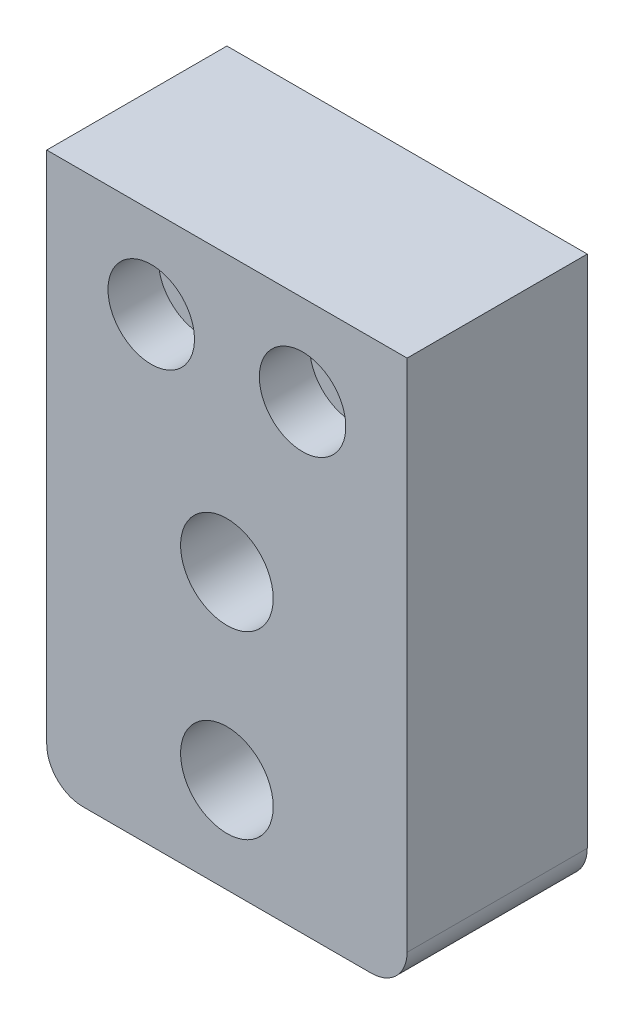
ISO-10303-21;
HEADER;
FILE_DESCRIPTION(('STEP AP214'),'2;1');
FILE_NAME('part.step','',(''),(''),'','','');
FILE_SCHEMA(('AUTOMOTIVE_DESIGN { 1 0 10303 214 1 1 1 1 }'));
ENDSEC;
DATA;
#1=APPLICATION_CONTEXT('core data for automotive mechanical design processes');
#2=APPLICATION_PROTOCOL_DEFINITION('international standard','automotive_design',2000,#1);
#3=PRODUCT_CONTEXT('',#1,'mechanical');
#4=PRODUCT('Part','Part','',(#3));
#5=PRODUCT_RELATED_PRODUCT_CATEGORY('part','',(#4));
#6=PRODUCT_DEFINITION_FORMATION('','',#4);
#7=PRODUCT_DEFINITION_CONTEXT('part definition',#1,'design');
#8=PRODUCT_DEFINITION('design','',#6,#7);
#9=PRODUCT_DEFINITION_SHAPE('','',#8);
#10=(LENGTH_UNIT() NAMED_UNIT(*) SI_UNIT(.MILLI.,.METRE.));
#11=(NAMED_UNIT(*) PLANE_ANGLE_UNIT() SI_UNIT($,.RADIAN.));
#12=(NAMED_UNIT(*) SI_UNIT($,.STERADIAN.) SOLID_ANGLE_UNIT());
#13=UNCERTAINTY_MEASURE_WITH_UNIT(LENGTH_MEASURE(1.E-05),#10,'distance_accuracy_value','');
#14=(GEOMETRIC_REPRESENTATION_CONTEXT(3) GLOBAL_UNCERTAINTY_ASSIGNED_CONTEXT((#13)) GLOBAL_UNIT_ASSIGNED_CONTEXT((#10,
#11,#12)) REPRESENTATION_CONTEXT('',''));
#15=CARTESIAN_POINT('',(0.,0.,0.));
#16=DIRECTION('',(0.,0.,1.));
#17=DIRECTION('',(1.,0.,0.));
#18=AXIS2_PLACEMENT_3D('',#15,#16,#17);
#19=CARTESIAN_POINT('',(0.,0.,-12.7));
#20=DIRECTION('',(1.,0.,0.));
#21=DIRECTION('',(0.,0.,1.));
#22=AXIS2_PLACEMENT_3D('',#19,#20,#21);
#23=PLANE('',#22);
#24=DIRECTION('',(0.,-1.,0.));
#25=VECTOR('',#24,1.);
#26=CARTESIAN_POINT('',(0.,0.,0.));
#27=LINE('',#26,#25);
#28=CARTESIAN_POINT('',(0.,38.8112,0.));
#29=VERTEX_POINT('',#28);
#30=CARTESIAN_POINT('',(0.,2.54,0.));
#31=VERTEX_POINT('',#30);
#32=EDGE_CURVE('E117',#29,#31,#27,.T.);
#33=ORIENTED_EDGE('',*,*,#32,.F.);
#34=DIRECTION('',(0.,0.,1.));
#35=VECTOR('',#34,1.);
#36=CARTESIAN_POINT('',(0.,38.8112,-12.7));
#37=LINE('',#36,#35);
#38=CARTESIAN_POINT('',(0.,38.8112,-12.7));
#39=VERTEX_POINT('',#38);
#40=EDGE_CURVE('E97',#39,#29,#37,.T.);
#41=ORIENTED_EDGE('',*,*,#40,.F.);
#42=DIRECTION('',(0.,-1.,0.));
#43=VECTOR('',#42,1.);
#44=CARTESIAN_POINT('',(0.,0.,-12.7));
#45=LINE('',#44,#43);
#46=CARTESIAN_POINT('',(0.,2.54,-12.7));
#47=VERTEX_POINT('',#46);
#48=EDGE_CURVE('E93',#39,#47,#45,.T.);
#49=ORIENTED_EDGE('',*,*,#48,.T.);
#50=DIRECTION('',(0.,0.,1.));
#51=VECTOR('',#50,1.);
#52=CARTESIAN_POINT('',(0.,2.54,-12.7));
#53=LINE('',#52,#51);
#54=EDGE_CURVE('E11',#31,#47,#53,.F.);
#55=ORIENTED_EDGE('',*,*,#54,.F.);
#56=EDGE_LOOP('',(#33,#41,#49,#55));
#57=FACE_BOUND('',#56,.T.);
#58=ADVANCED_FACE('F39',(#57),#23,.F.);
#59=CARTESIAN_POINT('',(0.,0.,-12.7));
#60=DIRECTION('',(0.,1.,0.));
#61=DIRECTION('',(0.,0.,-1.));
#62=AXIS2_PLACEMENT_3D('',#59,#60,#61);
#63=PLANE('',#62);
#64=DIRECTION('',(1.,0.,0.));
#65=VECTOR('',#64,1.);
#66=CARTESIAN_POINT('',(0.,0.,0.));
#67=LINE('',#66,#65);
#68=CARTESIAN_POINT('',(2.54,0.,0.));
#69=VERTEX_POINT('',#68);
#70=CARTESIAN_POINT('',(22.86,0.,0.));
#71=VERTEX_POINT('',#70);
#72=EDGE_CURVE('E120',#69,#71,#67,.T.);
#73=ORIENTED_EDGE('',*,*,#72,.F.);
#74=DIRECTION('',(0.,0.,1.));
#75=VECTOR('',#74,1.);
#76=CARTESIAN_POINT('',(2.54,0.,-12.7));
#77=LINE('',#76,#75);
#78=CARTESIAN_POINT('',(2.54,0.,-12.7));
#79=VERTEX_POINT('',#78);
#80=EDGE_CURVE('E133',#79,#69,#77,.T.);
#81=ORIENTED_EDGE('',*,*,#80,.F.);
#82=DIRECTION('',(1.,0.,0.));
#83=VECTOR('',#82,1.);
#84=CARTESIAN_POINT('',(0.,0.,-12.7));
#85=LINE('',#84,#83);
#86=CARTESIAN_POINT('',(22.86,0.,-12.7));
#87=VERTEX_POINT('',#86);
#88=EDGE_CURVE('E111',#79,#87,#85,.T.);
#89=ORIENTED_EDGE('',*,*,#88,.T.);
#90=DIRECTION('',(0.,0.,1.));
#91=VECTOR('',#90,1.);
#92=CARTESIAN_POINT('',(22.86,0.,-12.7));
#93=LINE('',#92,#91);
#94=EDGE_CURVE('E136',#71,#87,#93,.F.);
#95=ORIENTED_EDGE('',*,*,#94,.F.);
#96=EDGE_LOOP('',(#73,#81,#89,#95));
#97=FACE_BOUND('',#96,.T.);
#98=ADVANCED_FACE('F144',(#97),#63,.F.);
#99=CARTESIAN_POINT('',(25.4,0.,-12.7));
#100=DIRECTION('',(-1.,0.,0.));
#101=DIRECTION('',(0.,0.,-1.));
#102=AXIS2_PLACEMENT_3D('',#99,#100,#101);
#103=PLANE('',#102);
#104=DIRECTION('',(0.,1.,0.));
#105=VECTOR('',#104,1.);
#106=CARTESIAN_POINT('',(25.4,0.,-12.7));
#107=LINE('',#106,#105);
#108=CARTESIAN_POINT('',(25.4,2.54,-12.7));
#109=VERTEX_POINT('',#108);
#110=CARTESIAN_POINT('',(25.4,38.8112,-12.7));
#111=VERTEX_POINT('',#110);
#112=EDGE_CURVE('E91',#109,#111,#107,.T.);
#113=ORIENTED_EDGE('',*,*,#112,.T.);
#114=DIRECTION('',(0.,0.,1.));
#115=VECTOR('',#114,1.);
#116=CARTESIAN_POINT('',(25.4,38.8112,-12.7));
#117=LINE('',#116,#115);
#118=CARTESIAN_POINT('',(25.4,38.8112,0.));
#119=VERTEX_POINT('',#118);
#120=EDGE_CURVE('E100',#111,#119,#117,.T.);
#121=ORIENTED_EDGE('',*,*,#120,.T.);
#122=DIRECTION('',(0.,1.,0.));
#123=VECTOR('',#122,1.);
#124=CARTESIAN_POINT('',(25.4,0.,0.));
#125=LINE('',#124,#123);
#126=CARTESIAN_POINT('',(25.4,2.54,0.));
#127=VERTEX_POINT('',#126);
#128=EDGE_CURVE('E124',#127,#119,#125,.T.);
#129=ORIENTED_EDGE('',*,*,#128,.F.);
#130=DIRECTION('',(0.,0.,1.));
#131=VECTOR('',#130,1.);
#132=CARTESIAN_POINT('',(25.4,2.54,-12.7));
#133=LINE('',#132,#131);
#134=EDGE_CURVE('E106',#109,#127,#133,.T.);
#135=ORIENTED_EDGE('',*,*,#134,.F.);
#136=EDGE_LOOP('',(#113,#121,#129,#135));
#137=FACE_BOUND('',#136,.T.);
#138=ADVANCED_FACE('F109',(#137),#103,.F.);
#139=CARTESIAN_POINT('',(0.,38.8112,-12.7));
#140=DIRECTION('',(0.,-1.,0.));
#141=DIRECTION('',(0.,0.,1.));
#142=AXIS2_PLACEMENT_3D('',#139,#140,#141);
#143=PLANE('',#142);
#144=DIRECTION('',(-1.,0.,0.));
#145=VECTOR('',#144,1.);
#146=CARTESIAN_POINT('',(0.,38.8112,0.));
#147=LINE('',#146,#145);
#148=EDGE_CURVE('E102',#119,#29,#147,.T.);
#149=ORIENTED_EDGE('',*,*,#148,.F.);
#150=ORIENTED_EDGE('',*,*,#120,.F.);
#151=DIRECTION('',(-1.,0.,0.));
#152=VECTOR('',#151,1.);
#153=CARTESIAN_POINT('',(0.,38.8112,-12.7));
#154=LINE('',#153,#152);
#155=EDGE_CURVE('E87',#111,#39,#154,.T.);
#156=ORIENTED_EDGE('',*,*,#155,.T.);
#157=ORIENTED_EDGE('',*,*,#40,.T.);
#158=EDGE_LOOP('',(#149,#150,#156,#157));
#159=FACE_BOUND('',#158,.T.);
#160=ADVANCED_FACE('F101',(#159),#143,.F.);
#161=CARTESIAN_POINT('',(0.,0.,-12.7));
#162=DIRECTION('',(0.,0.,1.));
#163=DIRECTION('',(-1.,0.,0.));
#164=AXIS2_PLACEMENT_3D('',#161,#162,#163);
#165=PLANE('',#164);
#166=CARTESIAN_POINT('',(18.034,32.4612,-12.7));
#167=DIRECTION('',(0.,0.,-1.));
#168=DIRECTION('',(-1.,0.,0.));
#169=AXIS2_PLACEMENT_3D('',#166,#167,#168);
#170=CIRCLE('',#169,1.8288);
#171=CARTESIAN_POINT('',(16.2052,32.4612,-12.7));
#172=VERTEX_POINT('',#171);
#173=EDGE_CURVE('E185',#172,#172,#170,.T.);
#174=ORIENTED_EDGE('',*,*,#173,.F.);
#175=EDGE_LOOP('',(#174));
#176=FACE_BOUND('',#175,.T.);
#177=CARTESIAN_POINT('',(7.366,32.4612,-12.7));
#178=DIRECTION('',(0.,0.,-1.));
#179=DIRECTION('',(-1.,0.,0.));
#180=AXIS2_PLACEMENT_3D('',#177,#178,#179);
#181=CIRCLE('',#180,1.8288);
#182=CARTESIAN_POINT('',(5.5372,32.4612,-12.7));
#183=VERTEX_POINT('',#182);
#184=EDGE_CURVE('E173',#183,#183,#181,.T.);
#185=ORIENTED_EDGE('',*,*,#184,.F.);
#186=EDGE_LOOP('',(#185));
#187=FACE_BOUND('',#186,.T.);
#188=CARTESIAN_POINT('',(12.7,19.4056,-12.7));
#189=DIRECTION('',(0.,0.,1.));
#190=DIRECTION('',(1.,0.,0.));
#191=AXIS2_PLACEMENT_3D('',#188,#189,#190);
#192=CIRCLE('',#191,5.08);
#193=CARTESIAN_POINT('',(17.78,19.4056,-12.7));
#194=VERTEX_POINT('',#193);
#195=EDGE_CURVE('E170',#194,#194,#192,.T.);
#196=ORIENTED_EDGE('',*,*,#195,.T.);
#197=EDGE_LOOP('',(#196));
#198=FACE_BOUND('',#197,.T.);
#199=CARTESIAN_POINT('',(12.7,6.7056,-12.7));
#200=DIRECTION('',(0.,0.,1.));
#201=DIRECTION('',(1.,0.,0.));
#202=AXIS2_PLACEMENT_3D('',#199,#200,#201);
#203=CIRCLE('',#202,5.08);
#204=CARTESIAN_POINT('',(17.78,6.7056,-12.7));
#205=VERTEX_POINT('',#204);
#206=EDGE_CURVE('E158',#205,#205,#203,.T.);
#207=ORIENTED_EDGE('',*,*,#206,.T.);
#208=EDGE_LOOP('',(#207));
#209=FACE_BOUND('',#208,.T.);
#210=ORIENTED_EDGE('',*,*,#88,.F.);
#211=CARTESIAN_POINT('',(2.54,2.54,-12.7));
#212=DIRECTION('',(0.,0.,-1.));
#213=DIRECTION('',(-1.,0.,0.));
#214=AXIS2_PLACEMENT_3D('',#211,#212,#213);
#215=CIRCLE('',#214,2.54);
#216=EDGE_CURVE('E54',#47,#79,#215,.F.);
#217=ORIENTED_EDGE('',*,*,#216,.F.);
#218=ORIENTED_EDGE('',*,*,#48,.F.);
#219=ORIENTED_EDGE('',*,*,#155,.F.);
#220=ORIENTED_EDGE('',*,*,#112,.F.);
#221=CARTESIAN_POINT('',(22.86,2.54,-12.7));
#222=DIRECTION('',(0.,0.,-1.));
#223=DIRECTION('',(-1.,0.,0.));
#224=AXIS2_PLACEMENT_3D('',#221,#222,#223);
#225=CIRCLE('',#224,2.54);
#226=EDGE_CURVE('E47',#87,#109,#225,.F.);
#227=ORIENTED_EDGE('',*,*,#226,.F.);
#228=EDGE_LOOP('',(#210,#217,#218,#219,#220,#227));
#229=FACE_BOUND('',#228,.T.);
#230=ADVANCED_FACE('F89',(#176,#187,#198,#209,#229),#165,.F.);
#231=CARTESIAN_POINT('',(0.,0.,0.));
#232=DIRECTION('',(0.,0.,1.));
#233=DIRECTION('',(-1.,0.,0.));
#234=AXIS2_PLACEMENT_3D('',#231,#232,#233);
#235=PLANE('',#234);
#236=CARTESIAN_POINT('',(18.034,32.4612,0.));
#237=DIRECTION('',(0.,0.,-1.));
#238=DIRECTION('',(-1.,0.,0.));
#239=AXIS2_PLACEMENT_3D('',#236,#237,#238);
#240=CIRCLE('',#239,3.048);
#241=CARTESIAN_POINT('',(14.986,32.4612,0.));
#242=VERTEX_POINT('',#241);
#243=EDGE_CURVE('E194',#242,#242,#240,.T.);
#244=ORIENTED_EDGE('',*,*,#243,.T.);
#245=EDGE_LOOP('',(#244));
#246=FACE_BOUND('',#245,.T.);
#247=CARTESIAN_POINT('',(7.366,32.4612,0.));
#248=DIRECTION('',(0.,0.,-1.));
#249=DIRECTION('',(-1.,0.,0.));
#250=AXIS2_PLACEMENT_3D('',#247,#248,#249);
#251=CIRCLE('',#250,3.048);
#252=CARTESIAN_POINT('',(4.318,32.4612,0.));
#253=VERTEX_POINT('',#252);
#254=EDGE_CURVE('E182',#253,#253,#251,.T.);
#255=ORIENTED_EDGE('',*,*,#254,.T.);
#256=EDGE_LOOP('',(#255));
#257=FACE_BOUND('',#256,.T.);
#258=CARTESIAN_POINT('',(12.7,19.4056,0.));
#259=DIRECTION('',(0.,0.,1.));
#260=DIRECTION('',(1.,0.,0.));
#261=AXIS2_PLACEMENT_3D('',#258,#259,#260);
#262=CIRCLE('',#261,3.2639);
#263=CARTESIAN_POINT('',(15.9639,19.4056,0.));
#264=VERTEX_POINT('',#263);
#265=EDGE_CURVE('E161',#264,#264,#262,.T.);
#266=ORIENTED_EDGE('',*,*,#265,.F.);
#267=EDGE_LOOP('',(#266));
#268=FACE_BOUND('',#267,.T.);
#269=CARTESIAN_POINT('',(12.7,6.7056,0.));
#270=DIRECTION('',(0.,0.,1.));
#271=DIRECTION('',(1.,0.,0.));
#272=AXIS2_PLACEMENT_3D('',#269,#270,#271);
#273=CIRCLE('',#272,3.2639);
#274=CARTESIAN_POINT('',(15.9639,6.7056,0.));
#275=VERTEX_POINT('',#274);
#276=EDGE_CURVE('E121',#275,#275,#273,.T.);
#277=ORIENTED_EDGE('',*,*,#276,.F.);
#278=EDGE_LOOP('',(#277));
#279=FACE_BOUND('',#278,.T.);
#280=ORIENTED_EDGE('',*,*,#128,.T.);
#281=ORIENTED_EDGE('',*,*,#148,.T.);
#282=ORIENTED_EDGE('',*,*,#32,.T.);
#283=CARTESIAN_POINT('',(2.54,2.54,0.));
#284=DIRECTION('',(0.,0.,-1.));
#285=DIRECTION('',(-1.,0.,0.));
#286=AXIS2_PLACEMENT_3D('',#283,#284,#285);
#287=CIRCLE('',#286,2.54);
#288=EDGE_CURVE('E129',#69,#31,#287,.T.);
#289=ORIENTED_EDGE('',*,*,#288,.F.);
#290=ORIENTED_EDGE('',*,*,#72,.T.);
#291=CARTESIAN_POINT('',(22.86,2.54,0.));
#292=DIRECTION('',(0.,0.,-1.));
#293=DIRECTION('',(-1.,0.,0.));
#294=AXIS2_PLACEMENT_3D('',#291,#292,#293);
#295=CIRCLE('',#294,2.54);
#296=EDGE_CURVE('E131',#127,#71,#295,.T.);
#297=ORIENTED_EDGE('',*,*,#296,.F.);
#298=EDGE_LOOP('',(#280,#281,#282,#289,#290,#297));
#299=FACE_BOUND('',#298,.T.);
#300=ADVANCED_FACE('F198',(#246,#257,#268,#279,#299),#235,.T.);
#301=CARTESIAN_POINT('',(12.7,6.7056,-12.7));
#302=DIRECTION('',(0.,0.,-1.));
#303=DIRECTION('',(1.,0.,0.));
#304=AXIS2_PLACEMENT_3D('',#301,#302,#303);
#305=CYLINDRICAL_SURFACE('',#304,3.2639);
#306=ORIENTED_EDGE('',*,*,#276,.T.);
#307=EDGE_LOOP('',(#306));
#308=FACE_BOUND('',#307,.T.);
#309=CARTESIAN_POINT('',(12.7,6.7056,-6.35));
#310=DIRECTION('',(0.,0.,1.));
#311=DIRECTION('',(1.,0.,0.));
#312=AXIS2_PLACEMENT_3D('',#309,#310,#311);
#313=CIRCLE('',#312,3.2639);
#314=CARTESIAN_POINT('',(15.9639,6.7056,-6.35));
#315=VERTEX_POINT('',#314);
#316=EDGE_CURVE('E152',#315,#315,#313,.T.);
#317=ORIENTED_EDGE('',*,*,#316,.F.);
#318=EDGE_LOOP('',(#317));
#319=FACE_BOUND('',#318,.T.);
#320=ADVANCED_FACE('F249',(#308,#319),#305,.F.);
#321=CARTESIAN_POINT('',(15.9639,6.7056,-6.35));
#322=DIRECTION('',(0.,0.,1.));
#323=DIRECTION('',(-1.,0.,0.));
#324=AXIS2_PLACEMENT_3D('',#321,#322,#323);
#325=PLANE('',#324);
#326=ORIENTED_EDGE('',*,*,#316,.T.);
#327=EDGE_LOOP('',(#326));
#328=FACE_BOUND('',#327,.T.);
#329=CARTESIAN_POINT('',(12.7,6.7056,-6.35));
#330=DIRECTION('',(0.,0.,1.));
#331=DIRECTION('',(1.,0.,0.));
#332=AXIS2_PLACEMENT_3D('',#329,#330,#331);
#333=CIRCLE('',#332,5.08);
#334=CARTESIAN_POINT('',(17.78,6.7056,-6.35));
#335=VERTEX_POINT('',#334);
#336=EDGE_CURVE('E155',#335,#335,#333,.T.);
#337=ORIENTED_EDGE('',*,*,#336,.F.);
#338=EDGE_LOOP('',(#337));
#339=FACE_BOUND('',#338,.T.);
#340=ADVANCED_FACE('F245',(#328,#339),#325,.F.);
#341=CARTESIAN_POINT('',(12.7,6.7056,-12.7));
#342=DIRECTION('',(0.,0.,-1.));
#343=DIRECTION('',(1.,0.,0.));
#344=AXIS2_PLACEMENT_3D('',#341,#342,#343);
#345=CYLINDRICAL_SURFACE('',#344,5.08);
#346=ORIENTED_EDGE('',*,*,#336,.T.);
#347=EDGE_LOOP('',(#346));
#348=FACE_BOUND('',#347,.T.);
#349=ORIENTED_EDGE('',*,*,#206,.F.);
#350=EDGE_LOOP('',(#349));
#351=FACE_BOUND('',#350,.T.);
#352=ADVANCED_FACE('F241',(#348,#351),#345,.F.);
#353=CARTESIAN_POINT('',(12.7,19.4056,-12.7));
#354=DIRECTION('',(0.,0.,-1.));
#355=DIRECTION('',(1.,0.,0.));
#356=AXIS2_PLACEMENT_3D('',#353,#354,#355);
#357=CYLINDRICAL_SURFACE('',#356,3.2639);
#358=ORIENTED_EDGE('',*,*,#265,.T.);
#359=EDGE_LOOP('',(#358));
#360=FACE_BOUND('',#359,.T.);
#361=CARTESIAN_POINT('',(12.7,19.4056,-6.35));
#362=DIRECTION('',(0.,0.,1.));
#363=DIRECTION('',(1.,0.,0.));
#364=AXIS2_PLACEMENT_3D('',#361,#362,#363);
#365=CIRCLE('',#364,3.2639);
#366=CARTESIAN_POINT('',(15.9639,19.4056,-6.35));
#367=VERTEX_POINT('',#366);
#368=EDGE_CURVE('E164',#367,#367,#365,.T.);
#369=ORIENTED_EDGE('',*,*,#368,.F.);
#370=EDGE_LOOP('',(#369));
#371=FACE_BOUND('',#370,.T.);
#372=ADVANCED_FACE('F232',(#360,#371),#357,.F.);
#373=CARTESIAN_POINT('',(15.9639,19.4056,-6.35));
#374=DIRECTION('',(0.,0.,1.));
#375=DIRECTION('',(-1.,0.,0.));
#376=AXIS2_PLACEMENT_3D('',#373,#374,#375);
#377=PLANE('',#376);
#378=ORIENTED_EDGE('',*,*,#368,.T.);
#379=EDGE_LOOP('',(#378));
#380=FACE_BOUND('',#379,.T.);
#381=CARTESIAN_POINT('',(12.7,19.4056,-6.35));
#382=DIRECTION('',(0.,0.,1.));
#383=DIRECTION('',(1.,0.,0.));
#384=AXIS2_PLACEMENT_3D('',#381,#382,#383);
#385=CIRCLE('',#384,5.08);
#386=CARTESIAN_POINT('',(17.78,19.4056,-6.35));
#387=VERTEX_POINT('',#386);
#388=EDGE_CURVE('E167',#387,#387,#385,.T.);
#389=ORIENTED_EDGE('',*,*,#388,.F.);
#390=EDGE_LOOP('',(#389));
#391=FACE_BOUND('',#390,.T.);
#392=ADVANCED_FACE('F226',(#380,#391),#377,.F.);
#393=CARTESIAN_POINT('',(12.7,19.4056,-12.7));
#394=DIRECTION('',(0.,0.,-1.));
#395=DIRECTION('',(1.,0.,0.));
#396=AXIS2_PLACEMENT_3D('',#393,#394,#395);
#397=CYLINDRICAL_SURFACE('',#396,5.08);
#398=ORIENTED_EDGE('',*,*,#388,.T.);
#399=EDGE_LOOP('',(#398));
#400=FACE_BOUND('',#399,.T.);
#401=ORIENTED_EDGE('',*,*,#195,.F.);
#402=EDGE_LOOP('',(#401));
#403=FACE_BOUND('',#402,.T.);
#404=ADVANCED_FACE('F220',(#400,#403),#397,.F.);
#405=CARTESIAN_POINT('',(22.86,2.54,-12.7));
#406=DIRECTION('',(0.,0.,1.));
#407=DIRECTION('',(-1.,0.,0.));
#408=AXIS2_PLACEMENT_3D('',#405,#406,#407);
#409=CYLINDRICAL_SURFACE('',#408,2.54);
#410=ORIENTED_EDGE('',*,*,#226,.T.);
#411=ORIENTED_EDGE('',*,*,#134,.T.);
#412=ORIENTED_EDGE('',*,*,#296,.T.);
#413=ORIENTED_EDGE('',*,*,#94,.T.);
#414=EDGE_LOOP('',(#410,#411,#412,#413));
#415=FACE_BOUND('',#414,.T.);
#416=ADVANCED_FACE('F139',(#415),#409,.T.);
#417=CARTESIAN_POINT('',(2.54,2.54,-12.7));
#418=DIRECTION('',(0.,0.,1.));
#419=DIRECTION('',(-1.,0.,0.));
#420=AXIS2_PLACEMENT_3D('',#417,#418,#419);
#421=CYLINDRICAL_SURFACE('',#420,2.54);
#422=ORIENTED_EDGE('',*,*,#216,.T.);
#423=ORIENTED_EDGE('',*,*,#80,.T.);
#424=ORIENTED_EDGE('',*,*,#288,.T.);
#425=ORIENTED_EDGE('',*,*,#54,.T.);
#426=EDGE_LOOP('',(#422,#423,#424,#425));
#427=FACE_BOUND('',#426,.T.);
#428=ADVANCED_FACE('F41',(#427),#421,.T.);
#429=CARTESIAN_POINT('',(7.366,32.4612,0.));
#430=DIRECTION('',(0.,0.,1.));
#431=DIRECTION('',(-1.,0.,0.));
#432=AXIS2_PLACEMENT_3D('',#429,#430,#431);
#433=CYLINDRICAL_SURFACE('',#432,1.8288);
#434=ORIENTED_EDGE('',*,*,#184,.T.);
#435=EDGE_LOOP('',(#434));
#436=FACE_BOUND('',#435,.T.);
#437=CARTESIAN_POINT('',(7.366,32.4612,-3.556));
#438=DIRECTION('',(0.,0.,-1.));
#439=DIRECTION('',(-1.,0.,0.));
#440=AXIS2_PLACEMENT_3D('',#437,#438,#439);
#441=CIRCLE('',#440,1.8288);
#442=CARTESIAN_POINT('',(5.5372,32.4612,-3.556));
#443=VERTEX_POINT('',#442);
#444=EDGE_CURVE('E176',#443,#443,#441,.T.);
#445=ORIENTED_EDGE('',*,*,#444,.F.);
#446=EDGE_LOOP('',(#445));
#447=FACE_BOUND('',#446,.T.);
#448=ADVANCED_FACE('F225',(#436,#447),#433,.F.);
#449=CARTESIAN_POINT('',(9.1948,32.4612,-3.556));
#450=DIRECTION('',(0.,0.,-1.));
#451=DIRECTION('',(1.,0.,0.));
#452=AXIS2_PLACEMENT_3D('',#449,#450,#451);
#453=PLANE('',#452);
#454=ORIENTED_EDGE('',*,*,#444,.T.);
#455=EDGE_LOOP('',(#454));
#456=FACE_BOUND('',#455,.T.);
#457=CARTESIAN_POINT('',(7.366,32.4612,-3.556));
#458=DIRECTION('',(0.,0.,-1.));
#459=DIRECTION('',(-1.,0.,0.));
#460=AXIS2_PLACEMENT_3D('',#457,#458,#459);
#461=CIRCLE('',#460,3.048);
#462=CARTESIAN_POINT('',(4.318,32.4612,-3.556));
#463=VERTEX_POINT('',#462);
#464=EDGE_CURVE('E179',#463,#463,#461,.T.);
#465=ORIENTED_EDGE('',*,*,#464,.F.);
#466=EDGE_LOOP('',(#465));
#467=FACE_BOUND('',#466,.T.);
#468=ADVANCED_FACE('F374',(#456,#467),#453,.F.);
#469=CARTESIAN_POINT('',(7.366,32.4612,0.));
#470=DIRECTION('',(0.,0.,1.));
#471=DIRECTION('',(-1.,0.,0.));
#472=AXIS2_PLACEMENT_3D('',#469,#470,#471);
#473=CYLINDRICAL_SURFACE('',#472,3.048);
#474=ORIENTED_EDGE('',*,*,#464,.T.);
#475=EDGE_LOOP('',(#474));
#476=FACE_BOUND('',#475,.T.);
#477=ORIENTED_EDGE('',*,*,#254,.F.);
#478=EDGE_LOOP('',(#477));
#479=FACE_BOUND('',#478,.T.);
#480=ADVANCED_FACE('F382',(#476,#479),#473,.F.);
#481=CARTESIAN_POINT('',(18.034,32.4612,0.));
#482=DIRECTION('',(0.,0.,1.));
#483=DIRECTION('',(-1.,0.,0.));
#484=AXIS2_PLACEMENT_3D('',#481,#482,#483);
#485=CYLINDRICAL_SURFACE('',#484,1.8288);
#486=ORIENTED_EDGE('',*,*,#173,.T.);
#487=EDGE_LOOP('',(#486));
#488=FACE_BOUND('',#487,.T.);
#489=CARTESIAN_POINT('',(18.034,32.4612,-3.556));
#490=DIRECTION('',(0.,0.,-1.));
#491=DIRECTION('',(-1.,0.,0.));
#492=AXIS2_PLACEMENT_3D('',#489,#490,#491);
#493=CIRCLE('',#492,1.8288);
#494=CARTESIAN_POINT('',(16.2052,32.4612,-3.556));
#495=VERTEX_POINT('',#494);
#496=EDGE_CURVE('E188',#495,#495,#493,.T.);
#497=ORIENTED_EDGE('',*,*,#496,.F.);
#498=EDGE_LOOP('',(#497));
#499=FACE_BOUND('',#498,.T.);
#500=ADVANCED_FACE('F209',(#488,#499),#485,.F.);
#501=CARTESIAN_POINT('',(19.8628,32.4612,-3.556));
#502=DIRECTION('',(0.,0.,-1.));
#503=DIRECTION('',(1.,0.,0.));
#504=AXIS2_PLACEMENT_3D('',#501,#502,#503);
#505=PLANE('',#504);
#506=ORIENTED_EDGE('',*,*,#496,.T.);
#507=EDGE_LOOP('',(#506));
#508=FACE_BOUND('',#507,.T.);
#509=CARTESIAN_POINT('',(18.034,32.4612,-3.556));
#510=DIRECTION('',(0.,0.,-1.));
#511=DIRECTION('',(-1.,0.,0.));
#512=AXIS2_PLACEMENT_3D('',#509,#510,#511);
#513=CIRCLE('',#512,3.048);
#514=CARTESIAN_POINT('',(14.986,32.4612,-3.556));
#515=VERTEX_POINT('',#514);
#516=EDGE_CURVE('E191',#515,#515,#513,.T.);
#517=ORIENTED_EDGE('',*,*,#516,.F.);
#518=EDGE_LOOP('',(#517));
#519=FACE_BOUND('',#518,.T.);
#520=ADVANCED_FACE('F203',(#508,#519),#505,.F.);
#521=CARTESIAN_POINT('',(18.034,32.4612,0.));
#522=DIRECTION('',(0.,0.,1.));
#523=DIRECTION('',(-1.,0.,0.));
#524=AXIS2_PLACEMENT_3D('',#521,#522,#523);
#525=CYLINDRICAL_SURFACE('',#524,3.048);
#526=ORIENTED_EDGE('',*,*,#516,.T.);
#527=EDGE_LOOP('',(#526));
#528=FACE_BOUND('',#527,.T.);
#529=ORIENTED_EDGE('',*,*,#243,.F.);
#530=EDGE_LOOP('',(#529));
#531=FACE_BOUND('',#530,.T.);
#532=ADVANCED_FACE('F201',(#528,#531),#525,.F.);
#533=CLOSED_SHELL('',(#58,#98,#138,#160,#230,#300,#320,#340,#352,#372,#392,#404,#416,#428,#448,
#468,#480,#500,#520,#532));
#534=MANIFOLD_SOLID_BREP('B2',#533);
#535=ADVANCED_BREP_SHAPE_REPRESENTATION('',(#18,#534),#14);
#536=SHAPE_DEFINITION_REPRESENTATION(#9,#535);
ENDSEC;
END-ISO-10303-21;
